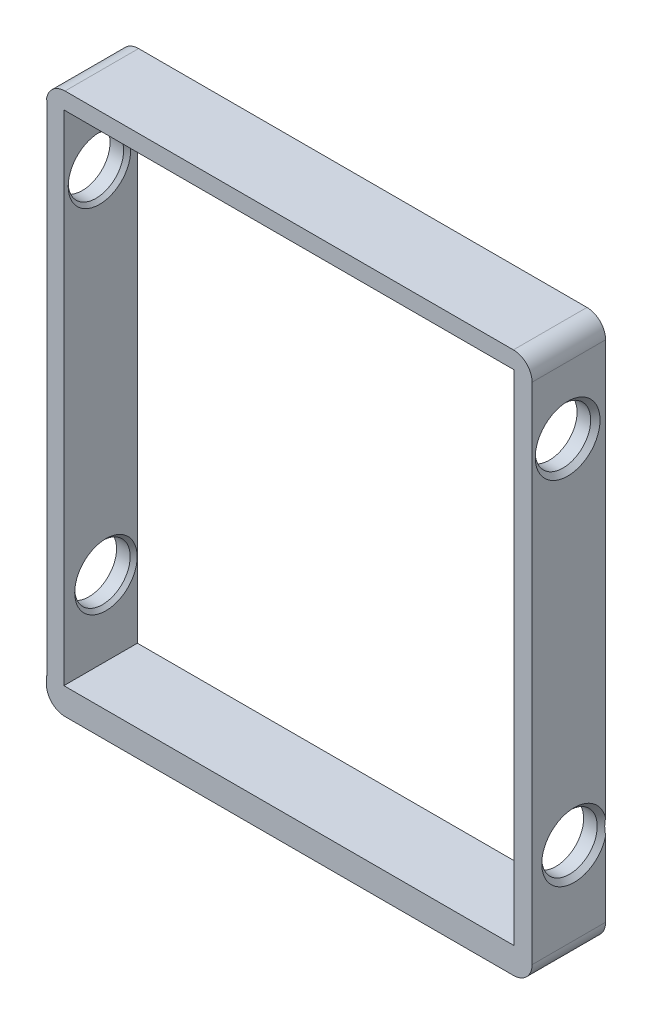
ISO-10303-21;
HEADER;
FILE_DESCRIPTION(('STEP AP214'),'2;1');
FILE_NAME('part.step','',(''),(''),'','','');
FILE_SCHEMA(('AUTOMOTIVE_DESIGN { 1 0 10303 214 1 1 1 1 }'));
ENDSEC;
DATA;
#1=APPLICATION_CONTEXT('core data for automotive mechanical design processes');
#2=APPLICATION_PROTOCOL_DEFINITION('international standard','automotive_design',2000,#1);
#3=PRODUCT_CONTEXT('',#1,'mechanical');
#4=PRODUCT('Part','Part','',(#3));
#5=PRODUCT_RELATED_PRODUCT_CATEGORY('part','',(#4));
#6=PRODUCT_DEFINITION_FORMATION('','',#4);
#7=PRODUCT_DEFINITION_CONTEXT('part definition',#1,'design');
#8=PRODUCT_DEFINITION('design','',#6,#7);
#9=PRODUCT_DEFINITION_SHAPE('','',#8);
#10=(LENGTH_UNIT() NAMED_UNIT(*) SI_UNIT(.MILLI.,.METRE.));
#11=(NAMED_UNIT(*) PLANE_ANGLE_UNIT() SI_UNIT($,.RADIAN.));
#12=(NAMED_UNIT(*) SI_UNIT($,.STERADIAN.) SOLID_ANGLE_UNIT());
#13=UNCERTAINTY_MEASURE_WITH_UNIT(LENGTH_MEASURE(1.E-05),#10,'distance_accuracy_value','');
#14=(GEOMETRIC_REPRESENTATION_CONTEXT(3) GLOBAL_UNCERTAINTY_ASSIGNED_CONTEXT((#13)) GLOBAL_UNIT_ASSIGNED_CONTEXT((#10,
#11,#12)) REPRESENTATION_CONTEXT('',''));
#15=CARTESIAN_POINT('',(0.,0.,0.));
#16=DIRECTION('',(0.,0.,1.));
#17=DIRECTION('',(1.,0.,0.));
#18=AXIS2_PLACEMENT_3D('',#15,#16,#17);
#19=CARTESIAN_POINT('',(26.5094815523711,57.7174566329013,0.));
#20=DIRECTION('',(1.,0.,0.));
#21=DIRECTION('',(0.,1.,0.));
#22=AXIS2_PLACEMENT_3D('',#19,#20,#21);
#23=PLANE('',#22);
#24=CARTESIAN_POINT('',(26.5094815523711,46.1082090890609,5.16610425964473));
#25=DIRECTION('',(1.,0.,0.));
#26=DIRECTION('',(0.,0.,-1.));
#27=AXIS2_PLACEMENT_3D('',#24,#25,#26);
#28=CIRCLE('',#27,4.40563);
#29=CARTESIAN_POINT('',(26.5094815523711,46.1082090890609,0.760474259644726));
#30=VERTEX_POINT('',#29);
#31=EDGE_CURVE('E200',#30,#30,#28,.T.);
#32=ORIENTED_EDGE('',*,*,#31,.F.);
#33=EDGE_LOOP('',(#32));
#34=FACE_BOUND('',#33,.T.);
#35=CARTESIAN_POINT('',(26.5094815523711,-2.17276238100504,4.28021487487287));
#36=DIRECTION('',(1.,0.,0.));
#37=DIRECTION('',(0.,0.,-1.));
#38=AXIS2_PLACEMENT_3D('',#35,#36,#37);
#39=CIRCLE('',#38,4.40563);
#40=CARTESIAN_POINT('',(26.5094815523711,-1.1290496227152,0.));
#41=VERTEX_POINT('',#40);
#42=CARTESIAN_POINT('',(26.5094815523711,-3.21647513929489,0.));
#43=VERTEX_POINT('',#42);
#44=EDGE_CURVE('E68',#41,#43,#39,.T.);
#45=ORIENTED_EDGE('',*,*,#44,.F.);
#46=DIRECTION('',(0.,1.,0.));
#47=VECTOR('',#46,1.);
#48=CARTESIAN_POINT('',(26.5094815523711,57.7174566329013,0.));
#49=LINE('',#48,#47);
#50=CARTESIAN_POINT('',(26.5094815523711,55.1774566329013,0.));
#51=VERTEX_POINT('',#50);
#52=EDGE_CURVE('E254',#41,#51,#49,.T.);
#53=ORIENTED_EDGE('',*,*,#52,.T.);
#54=DIRECTION('',(0.,0.,-1.));
#55=VECTOR('',#54,1.);
#56=CARTESIAN_POINT('',(26.5094815523711,55.1774566329013,0.));
#57=LINE('',#56,#55);
#58=CARTESIAN_POINT('',(26.5094815523711,55.1774566329013,10.));
#59=VERTEX_POINT('',#58);
#60=EDGE_CURVE('E261',#51,#59,#57,.F.);
#61=ORIENTED_EDGE('',*,*,#60,.T.);
#62=DIRECTION('',(0.,1.,0.));
#63=VECTOR('',#62,1.);
#64=CARTESIAN_POINT('',(26.5094815523711,0.,10.));
#65=LINE('',#64,#63);
#66=CARTESIAN_POINT('',(26.5094815523711,-13.4025433670987,10.));
#67=VERTEX_POINT('',#66);
#68=EDGE_CURVE('E266',#67,#59,#65,.T.);
#69=ORIENTED_EDGE('',*,*,#68,.F.);
#70=DIRECTION('',(0.,0.,-1.));
#71=VECTOR('',#70,1.);
#72=CARTESIAN_POINT('',(26.5094815523711,-13.4025433670987,0.));
#73=LINE('',#72,#71);
#74=CARTESIAN_POINT('',(26.5094815523711,-13.4025433670987,0.));
#75=VERTEX_POINT('',#74);
#76=EDGE_CURVE('E272',#67,#75,#73,.T.);
#77=ORIENTED_EDGE('',*,*,#76,.T.);
#78=EDGE_CURVE('E255',#75,#43,#49,.T.);
#79=ORIENTED_EDGE('',*,*,#78,.T.);
#80=EDGE_LOOP('',(#45,#53,#61,#69,#77,#79));
#81=FACE_BOUND('',#80,.T.);
#82=ADVANCED_FACE('F45',(#34,#81),#23,.T.);
#83=CARTESIAN_POINT('',(-39.5305184476289,-15.9425433670987,0.));
#84=DIRECTION('',(0.,-1.,0.));
#85=DIRECTION('',(1.,0.,0.));
#86=AXIS2_PLACEMENT_3D('',#83,#84,#85);
#87=PLANE('',#86);
#88=DIRECTION('',(1.,0.,0.));
#89=VECTOR('',#88,1.);
#90=CARTESIAN_POINT('',(-39.5305184476289,-15.9425433670987,0.));
#91=LINE('',#90,#89);
#92=CARTESIAN_POINT('',(-36.9905184476289,-15.9425433670987,0.));
#93=VERTEX_POINT('',#92);
#94=CARTESIAN_POINT('',(23.9694815523711,-15.9425433670987,0.));
#95=VERTEX_POINT('',#94);
#96=EDGE_CURVE('E258',#93,#95,#91,.T.);
#97=ORIENTED_EDGE('',*,*,#96,.T.);
#98=DIRECTION('',(0.,0.,-1.));
#99=VECTOR('',#98,1.);
#100=CARTESIAN_POINT('',(23.9694815523711,-15.9425433670987,0.));
#101=LINE('',#100,#99);
#102=CARTESIAN_POINT('',(23.9694815523711,-15.9425433670987,10.));
#103=VERTEX_POINT('',#102);
#104=EDGE_CURVE('E288',#95,#103,#101,.F.);
#105=ORIENTED_EDGE('',*,*,#104,.T.);
#106=DIRECTION('',(1.,0.,0.));
#107=VECTOR('',#106,1.);
#108=CARTESIAN_POINT('',(0.,-15.9425433670987,10.));
#109=LINE('',#108,#107);
#110=CARTESIAN_POINT('',(-36.9905184476289,-15.9425433670987,10.));
#111=VERTEX_POINT('',#110);
#112=EDGE_CURVE('E251',#111,#103,#109,.T.);
#113=ORIENTED_EDGE('',*,*,#112,.F.);
#114=DIRECTION('',(0.,0.,-1.));
#115=VECTOR('',#114,1.);
#116=CARTESIAN_POINT('',(-36.9905184476289,-15.9425433670987,0.));
#117=LINE('',#116,#115);
#118=EDGE_CURVE('E285',#111,#93,#117,.T.);
#119=ORIENTED_EDGE('',*,*,#118,.T.);
#120=EDGE_LOOP('',(#97,#105,#113,#119));
#121=FACE_BOUND('',#120,.T.);
#122=ADVANCED_FACE('F332',(#121),#87,.T.);
#123=CARTESIAN_POINT('',(-39.5305184476289,57.7174566329013,0.));
#124=DIRECTION('',(-1.,0.,0.));
#125=DIRECTION('',(0.,-1.,0.));
#126=AXIS2_PLACEMENT_3D('',#123,#124,#125);
#127=PLANE('',#126);
#128=DIRECTION('',(0.,0.,1.));
#129=VECTOR('',#128,1.);
#130=CARTESIAN_POINT('',(-39.5305184476289,-12.3802127885408,0.));
#131=LINE('',#130,#129);
#132=CARTESIAN_POINT('',(-39.5305184476289,-12.3802127885408,0.));
#133=VERTEX_POINT('',#132);
#134=CARTESIAN_POINT('',(-39.5305184476289,-12.3802127885408,10.));
#135=VERTEX_POINT('',#134);
#136=EDGE_CURVE('E175',#133,#135,#131,.T.);
#137=ORIENTED_EDGE('',*,*,#136,.F.);
#138=DIRECTION('',(0.,-1.,0.));
#139=VECTOR('',#138,1.);
#140=CARTESIAN_POINT('',(-39.5305184476289,57.7174566329013,0.));
#141=LINE('',#140,#139);
#142=CARTESIAN_POINT('',(-39.5305184476289,-13.4025433670987,0.));
#143=VERTEX_POINT('',#142);
#144=EDGE_CURVE('E248',#133,#143,#141,.T.);
#145=ORIENTED_EDGE('',*,*,#144,.T.);
#146=DIRECTION('',(0.,0.,-1.));
#147=VECTOR('',#146,1.);
#148=CARTESIAN_POINT('',(-39.5305184476289,-13.4025433670987,0.));
#149=LINE('',#148,#147);
#150=CARTESIAN_POINT('',(-39.5305184476289,-13.4025433670987,10.));
#151=VERTEX_POINT('',#150);
#152=EDGE_CURVE('E298',#143,#151,#149,.F.);
#153=ORIENTED_EDGE('',*,*,#152,.T.);
#154=DIRECTION('',(0.,1.,0.));
#155=VECTOR('',#154,1.);
#156=CARTESIAN_POINT('',(-39.5305184476289,0.,10.));
#157=LINE('',#156,#155);
#158=EDGE_CURVE('E247',#135,#151,#157,.F.);
#159=ORIENTED_EDGE('',*,*,#158,.F.);
#160=EDGE_LOOP('',(#137,#145,#153,#159));
#161=FACE_BOUND('',#160,.T.);
#162=ADVANCED_FACE('F329',(#161),#127,.T.);
#163=CARTESIAN_POINT('',(-39.5305184476289,57.7174566329013,0.));
#164=DIRECTION('',(0.,1.,0.));
#165=DIRECTION('',(-1.,0.,0.));
#166=AXIS2_PLACEMENT_3D('',#163,#164,#165);
#167=PLANE('',#166);
#168=DIRECTION('',(-1.,0.,0.));
#169=VECTOR('',#168,1.);
#170=CARTESIAN_POINT('',(-39.5305184476289,57.7174566329013,0.));
#171=LINE('',#170,#169);
#172=CARTESIAN_POINT('',(23.9694815523712,57.7174566329013,0.));
#173=VERTEX_POINT('',#172);
#174=CARTESIAN_POINT('',(-36.9905184476289,57.7174566329013,0.));
#175=VERTEX_POINT('',#174);
#176=EDGE_CURVE('E250',#173,#175,#171,.T.);
#177=ORIENTED_EDGE('',*,*,#176,.T.);
#178=DIRECTION('',(0.,0.,-1.));
#179=VECTOR('',#178,1.);
#180=CARTESIAN_POINT('',(-36.9905184476289,57.7174566329013,0.));
#181=LINE('',#180,#179);
#182=CARTESIAN_POINT('',(-36.9905184476289,57.7174566329013,10.));
#183=VERTEX_POINT('',#182);
#184=EDGE_CURVE('E304',#175,#183,#181,.F.);
#185=ORIENTED_EDGE('',*,*,#184,.T.);
#186=DIRECTION('',(1.,0.,0.));
#187=VECTOR('',#186,1.);
#188=CARTESIAN_POINT('',(0.,57.7174566329013,10.));
#189=LINE('',#188,#187);
#190=CARTESIAN_POINT('',(23.9694815523712,57.7174566329013,10.));
#191=VERTEX_POINT('',#190);
#192=EDGE_CURVE('E263',#191,#183,#189,.F.);
#193=ORIENTED_EDGE('',*,*,#192,.F.);
#194=DIRECTION('',(0.,0.,-1.));
#195=VECTOR('',#194,1.);
#196=CARTESIAN_POINT('',(23.9694815523712,57.7174566329013,0.));
#197=LINE('',#196,#195);
#198=EDGE_CURVE('E301',#191,#173,#197,.T.);
#199=ORIENTED_EDGE('',*,*,#198,.T.);
#200=EDGE_LOOP('',(#177,#185,#193,#199));
#201=FACE_BOUND('',#200,.T.);
#202=ADVANCED_FACE('F323',(#201),#167,.T.);
#203=CARTESIAN_POINT('',(0.,0.,0.));
#204=DIRECTION('',(0.,0.,1.));
#205=DIRECTION('',(1.,0.,0.));
#206=AXIS2_PLACEMENT_3D('',#203,#204,#205);
#207=PLANE('',#206);
#208=DIRECTION('',(1.,0.,0.));
#209=VECTOR('',#208,1.);
#210=CARTESIAN_POINT('',(0.,-12.3802127885408,0.));
#211=LINE('',#210,#209);
#212=CARTESIAN_POINT('',(-37.1504098736964,-12.3802127885408,0.));
#213=VERTEX_POINT('',#212);
#214=CARTESIAN_POINT('',(24.0242618586237,-12.3802127885408,0.));
#215=VERTEX_POINT('',#214);
#216=EDGE_CURVE('E228',#213,#215,#211,.T.);
#217=ORIENTED_EDGE('',*,*,#216,.T.);
#218=DIRECTION('',(0.,1.,0.));
#219=VECTOR('',#218,1.);
#220=CARTESIAN_POINT('',(24.0242618586237,0.,0.));
#221=LINE('',#220,#219);
#222=CARTESIAN_POINT('',(24.0242618586237,55.4164594921233,0.));
#223=VERTEX_POINT('',#222);
#224=EDGE_CURVE('E244',#215,#223,#221,.T.);
#225=ORIENTED_EDGE('',*,*,#224,.T.);
#226=DIRECTION('',(-1.,0.,0.));
#227=VECTOR('',#226,1.);
#228=CARTESIAN_POINT('',(0.,55.4164594921233,0.));
#229=LINE('',#228,#227);
#230=CARTESIAN_POINT('',(-37.1504098736964,55.4164594921233,0.));
#231=VERTEX_POINT('',#230);
#232=EDGE_CURVE('E241',#223,#231,#229,.T.);
#233=ORIENTED_EDGE('',*,*,#232,.T.);
#234=DIRECTION('',(0.,-1.,0.));
#235=VECTOR('',#234,1.);
#236=CARTESIAN_POINT('',(-37.1504098736964,0.,0.));
#237=LINE('',#236,#235);
#238=EDGE_CURVE('E238',#231,#213,#237,.T.);
#239=ORIENTED_EDGE('',*,*,#238,.T.);
#240=EDGE_LOOP('',(#217,#225,#233,#239));
#241=FACE_BOUND('',#240,.T.);
#242=DIRECTION('',(0.,1.,0.));
#243=VECTOR('',#242,1.);
#244=CARTESIAN_POINT('',(-39.4757381413763,0.,0.));
#245=LINE('',#244,#243);
#246=CARTESIAN_POINT('',(-39.4757381413763,-12.3802127885408,0.));
#247=VERTEX_POINT('',#246);
#248=CARTESIAN_POINT('',(-39.4757381413763,55.4164594921233,0.));
#249=VERTEX_POINT('',#248);
#250=EDGE_CURVE('E166',#247,#249,#245,.T.);
#251=ORIENTED_EDGE('',*,*,#250,.T.);
#252=DIRECTION('',(-1.,0.,0.));
#253=VECTOR('',#252,1.);
#254=CARTESIAN_POINT('',(0.,55.4164594921233,0.));
#255=LINE('',#254,#253);
#256=CARTESIAN_POINT('',(-39.5192488866602,55.4164594921233,0.));
#257=VERTEX_POINT('',#256);
#258=EDGE_CURVE('E192',#249,#257,#255,.T.);
#259=ORIENTED_EDGE('',*,*,#258,.T.);
#260=CARTESIAN_POINT('',(-36.9905184476289,55.1774566329013,0.));
#261=DIRECTION('',(0.,0.,1.));
#262=DIRECTION('',(1.,0.,0.));
#263=AXIS2_PLACEMENT_3D('',#260,#261,#262);
#264=CIRCLE('',#263,2.53999999999999);
#265=EDGE_CURVE('E278',#257,#175,#264,.F.);
#266=ORIENTED_EDGE('',*,*,#265,.T.);
#267=ORIENTED_EDGE('',*,*,#176,.F.);
#268=CARTESIAN_POINT('',(23.9694815523712,55.1774566329013,0.));
#269=DIRECTION('',(0.,0.,1.));
#270=DIRECTION('',(1.,0.,0.));
#271=AXIS2_PLACEMENT_3D('',#268,#269,#270);
#272=CIRCLE('',#271,2.53999999999999);
#273=EDGE_CURVE('E275',#173,#51,#272,.F.);
#274=ORIENTED_EDGE('',*,*,#273,.T.);
#275=ORIENTED_EDGE('',*,*,#52,.F.);
#276=CARTESIAN_POINT('',(27.3144886342901,-5.14437800628135,0.));
#277=CARTESIAN_POINT('',(27.2712276251026,-5.06851306918809,0.));
#278=CARTESIAN_POINT('',(27.2288033845421,-4.99217190890156,0.));
#279=CARTESIAN_POINT('',(27.1458609826951,-4.8384366098738,0.));
#280=CARTESIAN_POINT('',(27.1053433201205,-4.7610422023804,0.));
#281=CARTESIAN_POINT('',(26.9867349355243,-4.52659981179214,0.));
#282=CARTESIAN_POINT('',(26.9119189546052,-4.36786380361834,0.));
#283=CARTESIAN_POINT('',(26.7725597110636,-4.04316484814592,0.));
#284=CARTESIAN_POINT('',(26.7081808794207,-3.87713053800014,0.));
#285=CARTESIAN_POINT('',(26.5943992910559,-3.54017410672882,0.));
#286=CARTESIAN_POINT('',(26.5449720522571,-3.36926048294398,0.));
#287=CARTESIAN_POINT('',(26.4799584901082,-3.08972342562123,0.));
#288=CARTESIAN_POINT('',(26.4586676716259,-2.98241735196453,0.));
#289=CARTESIAN_POINT('',(26.4237447664393,-2.76654052793717,0.));
#290=CARTESIAN_POINT('',(26.4101130541241,-2.65796971600888,0.));
#291=CARTESIAN_POINT('',(26.3911111458481,-2.44097930024858,0.));
#292=CARTESIAN_POINT('',(26.3856755043132,-2.33256547990702,0.));
#293=CARTESIAN_POINT('',(26.383073113827,-2.11563733361422,0.));
#294=CARTESIAN_POINT('',(26.3859065608992,-2.00712300534134,0.));
#295=CARTESIAN_POINT('',(26.4007661845265,-1.77446971110606,0.));
#296=CARTESIAN_POINT('',(26.4140999532049,-1.65041336479439,0.));
#297=CARTESIAN_POINT('',(26.450879696461,-1.40380210618889,0.));
#298=CARTESIAN_POINT('',(26.4743283449274,-1.28124759972556,0.));
#299=CARTESIAN_POINT('',(26.5306324688548,-1.03676933743719,0.));
#300=CARTESIAN_POINT('',(26.5635990797697,-0.914871461359717,0.));
#301=CARTESIAN_POINT('',(26.6375637402529,-0.673596870395876,0.));
#302=CARTESIAN_POINT('',(26.6785600694115,-0.554219621510677,0.));
#303=CARTESIAN_POINT('',(26.7823038664066,-0.278273129342077,0.));
#304=CARTESIAN_POINT('',(26.8477274203599,-0.122714001289644,0.));
#305=CARTESIAN_POINT('',(26.9881359313089,0.184060267302188,0.));
#306=CARTESIAN_POINT('',(27.0631259954584,0.335273034279609,0.));
#307=CARTESIAN_POINT('',(27.2208374342123,0.634281208222182,0.));
#308=CARTESIAN_POINT('',(27.3035858408563,0.782062245592443,0.));
#309=CARTESIAN_POINT('',(27.4749373532114,1.07412887297117,0.));
#310=CARTESIAN_POINT('',(27.5635393629038,1.21841511046475,0.));
#311=CARTESIAN_POINT('',(27.7409997858099,1.49713947341925,0.));
#312=CARTESIAN_POINT('',(27.8296401644751,1.6317171437581,0.));
#313=CARTESIAN_POINT('',(28.0103234101149,1.8985771716374,0.));
#314=CARTESIAN_POINT('',(28.1023665494765,2.03085934417515,0.));
#315=CARTESIAN_POINT('',(28.2884007090331,2.29230062825798,0.));
#316=CARTESIAN_POINT('',(28.3823676455485,2.42147693706759,0.));
#317=CARTESIAN_POINT('',(28.5725410643814,2.67811837980125,0.));
#318=CARTESIAN_POINT('',(28.6687469366096,2.80558396529478,0.));
#319=CARTESIAN_POINT('',(28.7658590461831,2.93234334488588,0.));
#320=B_SPLINE_CURVE_WITH_KNOTS('',3,(#276,#277,#278,#279,#280,#281,#282,#283,#284,#285,#286,
#287,#288,#289,#290,#291,#292,#293,#294,#295,#296,#297,#298,#299,#300,#301,#302,#303,#304,#305,
#306,#307,#308,#309,#310,#311,#312,#313,#314,#315,#316,#317,#318,#319),.UNSPECIFIED.,.F.,.F.,(4,
2,2,2,2,2,2,2,2,2,2,2,2,2,2,2,2,2,2,2,2,4),(0.,0.261987772616421,0.524043697847519,
1.05013221699135,1.58383830005204,2.11666569033946,2.4446207551543,2.77259184952876,
3.09792996471409,3.42327579229656,3.79712857744841,4.17108025195626,4.54958830697742,
4.92801535318556,5.43385206005262,5.93995995069687,6.44790188080563,6.95574897279951,
7.43912752511334,7.92254485544565,8.40173327999602,8.88079262458114),.UNSPECIFIED.);
#321=EDGE_CURVE('E54',#41,#43,#320,.F.);
#322=ORIENTED_EDGE('',*,*,#321,.T.);
#323=ORIENTED_EDGE('',*,*,#78,.F.);
#324=CARTESIAN_POINT('',(23.9694815523711,-13.4025433670987,0.));
#325=DIRECTION('',(0.,0.,1.));
#326=DIRECTION('',(1.,0.,0.));
#327=AXIS2_PLACEMENT_3D('',#324,#325,#326);
#328=CIRCLE('',#327,2.53999999999999);
#329=EDGE_CURVE('E283',#75,#95,#328,.F.);
#330=ORIENTED_EDGE('',*,*,#329,.T.);
#331=ORIENTED_EDGE('',*,*,#96,.F.);
#332=CARTESIAN_POINT('',(-36.9905184476289,-13.4025433670987,0.));
#333=DIRECTION('',(0.,0.,1.));
#334=DIRECTION('',(1.,0.,0.));
#335=AXIS2_PLACEMENT_3D('',#332,#333,#334);
#336=CIRCLE('',#335,2.53999999999999);
#337=EDGE_CURVE('E280',#93,#143,#336,.F.);
#338=ORIENTED_EDGE('',*,*,#337,.T.);
#339=ORIENTED_EDGE('',*,*,#144,.F.);
#340=DIRECTION('',(1.,0.,0.));
#341=VECTOR('',#340,1.);
#342=CARTESIAN_POINT('',(0.,-12.3802127885408,0.));
#343=LINE('',#342,#341);
#344=EDGE_CURVE('E196',#133,#247,#343,.T.);
#345=ORIENTED_EDGE('',*,*,#344,.T.);
#346=EDGE_LOOP('',(#251,#259,#266,#267,#274,#275,#322,#323,#330,#331,#338,#339,#345));
#347=FACE_BOUND('',#346,.T.);
#348=ADVANCED_FACE('F318',(#241,#347),#207,.F.);
#349=CARTESIAN_POINT('',(0.,0.,10.));
#350=DIRECTION('',(0.,0.,1.));
#351=DIRECTION('',(1.,0.,0.));
#352=AXIS2_PLACEMENT_3D('',#349,#350,#351);
#353=PLANE('',#352);
#354=DIRECTION('',(1.,0.,0.));
#355=VECTOR('',#354,1.);
#356=CARTESIAN_POINT('',(-39.4757381413763,55.4164594921233,10.));
#357=LINE('',#356,#355);
#358=CARTESIAN_POINT('',(-39.5192488866602,55.4164594921233,10.));
#359=VERTEX_POINT('',#358);
#360=CARTESIAN_POINT('',(-39.4757381413763,55.4164594921233,10.));
#361=VERTEX_POINT('',#360);
#362=EDGE_CURVE('E61',#359,#361,#357,.T.);
#363=ORIENTED_EDGE('',*,*,#362,.T.);
#364=DIRECTION('',(0.,-1.,0.));
#365=VECTOR('',#364,1.);
#366=CARTESIAN_POINT('',(-39.4757381413763,-12.3802127885408,10.));
#367=LINE('',#366,#365);
#368=CARTESIAN_POINT('',(-39.4757381413763,-12.3802127885408,10.));
#369=VERTEX_POINT('',#368);
#370=EDGE_CURVE('E164',#361,#369,#367,.T.);
#371=ORIENTED_EDGE('',*,*,#370,.T.);
#372=DIRECTION('',(-1.,0.,0.));
#373=VECTOR('',#372,1.);
#374=CARTESIAN_POINT('',(-39.4757381413763,-12.3802127885408,10.));
#375=LINE('',#374,#373);
#376=EDGE_CURVE('E172',#369,#135,#375,.T.);
#377=ORIENTED_EDGE('',*,*,#376,.T.);
#378=ORIENTED_EDGE('',*,*,#158,.T.);
#379=CARTESIAN_POINT('',(-36.9905184476289,-13.4025433670987,10.));
#380=DIRECTION('',(0.,0.,1.));
#381=DIRECTION('',(1.,0.,0.));
#382=AXIS2_PLACEMENT_3D('',#379,#380,#381);
#383=CIRCLE('',#382,2.53999999999999);
#384=EDGE_CURVE('E294',#151,#111,#383,.T.);
#385=ORIENTED_EDGE('',*,*,#384,.T.);
#386=ORIENTED_EDGE('',*,*,#112,.T.);
#387=CARTESIAN_POINT('',(23.9694815523711,-13.4025433670987,10.));
#388=DIRECTION('',(0.,0.,1.));
#389=DIRECTION('',(1.,0.,0.));
#390=AXIS2_PLACEMENT_3D('',#387,#388,#389);
#391=CIRCLE('',#390,2.53999999999999);
#392=EDGE_CURVE('E296',#103,#67,#391,.T.);
#393=ORIENTED_EDGE('',*,*,#392,.T.);
#394=ORIENTED_EDGE('',*,*,#68,.T.);
#395=CARTESIAN_POINT('',(23.9694815523712,55.1774566329013,10.));
#396=DIRECTION('',(0.,0.,1.));
#397=DIRECTION('',(1.,0.,0.));
#398=AXIS2_PLACEMENT_3D('',#395,#396,#397);
#399=CIRCLE('',#398,2.53999999999999);
#400=EDGE_CURVE('E290',#59,#191,#399,.T.);
#401=ORIENTED_EDGE('',*,*,#400,.T.);
#402=ORIENTED_EDGE('',*,*,#192,.T.);
#403=CARTESIAN_POINT('',(-36.9905184476289,55.1774566329013,10.));
#404=DIRECTION('',(0.,0.,1.));
#405=DIRECTION('',(1.,0.,0.));
#406=AXIS2_PLACEMENT_3D('',#403,#404,#405);
#407=CIRCLE('',#406,2.53999999999999);
#408=EDGE_CURVE('E292',#183,#359,#407,.T.);
#409=ORIENTED_EDGE('',*,*,#408,.T.);
#410=EDGE_LOOP('',(#363,#371,#377,#378,#385,#386,#393,#394,#401,#402,#409));
#411=FACE_BOUND('',#410,.T.);
#412=DIRECTION('',(0.,-1.,0.));
#413=VECTOR('',#412,1.);
#414=CARTESIAN_POINT('',(24.0242618586237,-12.3802127885408,10.));
#415=LINE('',#414,#413);
#416=CARTESIAN_POINT('',(24.0242618586237,55.4164594921233,10.));
#417=VERTEX_POINT('',#416);
#418=CARTESIAN_POINT('',(24.0242618586237,-12.3802127885408,10.));
#419=VERTEX_POINT('',#418);
#420=EDGE_CURVE('E212',#417,#419,#415,.T.);
#421=ORIENTED_EDGE('',*,*,#420,.T.);
#422=DIRECTION('',(-1.,0.,0.));
#423=VECTOR('',#422,1.);
#424=CARTESIAN_POINT('',(24.0242618586237,-12.3802127885408,10.));
#425=LINE('',#424,#423);
#426=CARTESIAN_POINT('',(-37.1504098736964,-12.3802127885408,10.));
#427=VERTEX_POINT('',#426);
#428=EDGE_CURVE('E215',#419,#427,#425,.T.);
#429=ORIENTED_EDGE('',*,*,#428,.T.);
#430=DIRECTION('',(0.,1.,0.));
#431=VECTOR('',#430,1.);
#432=CARTESIAN_POINT('',(-37.1504098736964,-12.3802127885408,10.));
#433=LINE('',#432,#431);
#434=CARTESIAN_POINT('',(-37.1504098736964,55.4164594921233,10.));
#435=VERTEX_POINT('',#434);
#436=EDGE_CURVE('E218',#427,#435,#433,.T.);
#437=ORIENTED_EDGE('',*,*,#436,.T.);
#438=DIRECTION('',(1.,0.,0.));
#439=VECTOR('',#438,1.);
#440=CARTESIAN_POINT('',(24.0242618586237,55.4164594921233,10.));
#441=LINE('',#440,#439);
#442=EDGE_CURVE('E221',#435,#417,#441,.T.);
#443=ORIENTED_EDGE('',*,*,#442,.T.);
#444=EDGE_LOOP('',(#421,#429,#437,#443));
#445=FACE_BOUND('',#444,.T.);
#446=ADVANCED_FACE('F179',(#411,#445),#353,.T.);
#447=CARTESIAN_POINT('',(24.0242618586237,-12.3802127885408,10.));
#448=DIRECTION('',(1.,0.,0.));
#449=DIRECTION('',(0.,0.,-1.));
#450=AXIS2_PLACEMENT_3D('',#447,#448,#449);
#451=PLANE('',#450);
#452=CARTESIAN_POINT('',(24.0242618586237,46.1082090890609,5.16610425964473));
#453=DIRECTION('',(1.,0.,0.));
#454=DIRECTION('',(0.,0.,-1.));
#455=AXIS2_PLACEMENT_3D('',#452,#453,#454);
#456=CIRCLE('',#455,3.77063);
#457=CARTESIAN_POINT('',(24.0242618586237,46.1082090890609,1.39547425964473));
#458=VERTEX_POINT('',#457);
#459=EDGE_CURVE('E206',#458,#458,#456,.T.);
#460=ORIENTED_EDGE('',*,*,#459,.T.);
#461=EDGE_LOOP('',(#460));
#462=FACE_BOUND('',#461,.T.);
#463=CARTESIAN_POINT('',(24.0242618586237,-2.17276238100504,4.28021487487287));
#464=DIRECTION('',(1.,0.,0.));
#465=DIRECTION('',(0.,0.,-1.));
#466=AXIS2_PLACEMENT_3D('',#463,#464,#465);
#467=CIRCLE('',#466,3.77063);
#468=CARTESIAN_POINT('',(24.0242618586237,-2.17276238100504,0.509584874872876));
#469=VERTEX_POINT('',#468);
#470=EDGE_CURVE('E211',#469,#469,#467,.T.);
#471=ORIENTED_EDGE('',*,*,#470,.T.);
#472=EDGE_LOOP('',(#471));
#473=FACE_BOUND('',#472,.T.);
#474=DIRECTION('',(0.,0.,-1.));
#475=VECTOR('',#474,1.);
#476=CARTESIAN_POINT('',(24.0242618586237,-12.3802127885408,10.));
#477=LINE('',#476,#475);
#478=EDGE_CURVE('E224',#419,#215,#477,.T.);
#479=ORIENTED_EDGE('',*,*,#478,.F.);
#480=ORIENTED_EDGE('',*,*,#420,.F.);
#481=DIRECTION('',(0.,0.,-1.));
#482=VECTOR('',#481,1.);
#483=CARTESIAN_POINT('',(24.0242618586237,55.4164594921233,10.));
#484=LINE('',#483,#482);
#485=EDGE_CURVE('E225',#417,#223,#484,.T.);
#486=ORIENTED_EDGE('',*,*,#485,.T.);
#487=ORIENTED_EDGE('',*,*,#224,.F.);
#488=EDGE_LOOP('',(#479,#480,#486,#487));
#489=FACE_BOUND('',#488,.T.);
#490=ADVANCED_FACE('F325',(#462,#473,#489),#451,.F.);
#491=CARTESIAN_POINT('',(24.0242618586237,55.4164594921233,10.));
#492=DIRECTION('',(0.,1.,0.));
#493=DIRECTION('',(0.,0.,1.));
#494=AXIS2_PLACEMENT_3D('',#491,#492,#493);
#495=PLANE('',#494);
#496=ORIENTED_EDGE('',*,*,#485,.F.);
#497=ORIENTED_EDGE('',*,*,#442,.F.);
#498=DIRECTION('',(0.,0.,-1.));
#499=VECTOR('',#498,1.);
#500=CARTESIAN_POINT('',(-37.1504098736964,55.4164594921233,10.));
#501=LINE('',#500,#499);
#502=EDGE_CURVE('E229',#435,#231,#501,.T.);
#503=ORIENTED_EDGE('',*,*,#502,.T.);
#504=ORIENTED_EDGE('',*,*,#232,.F.);
#505=EDGE_LOOP('',(#496,#497,#503,#504));
#506=FACE_BOUND('',#505,.T.);
#507=ADVANCED_FACE('F421',(#506),#495,.F.);
#508=CARTESIAN_POINT('',(-37.1504098736964,-12.3802127885408,10.));
#509=DIRECTION('',(-1.,0.,0.));
#510=DIRECTION('',(0.,0.,1.));
#511=AXIS2_PLACEMENT_3D('',#508,#509,#510);
#512=PLANE('',#511);
#513=CARTESIAN_POINT('',(-37.1504098736964,46.1082090890609,5.16610425964473));
#514=DIRECTION('',(-1.,0.,0.));
#515=DIRECTION('',(0.,0.,1.));
#516=AXIS2_PLACEMENT_3D('',#513,#514,#515);
#517=CIRCLE('',#516,4.24573857393241);
#518=CARTESIAN_POINT('',(-37.1504098736964,46.1082090890609,9.41184283357714));
#519=VERTEX_POINT('',#518);
#520=EDGE_CURVE('E49',#519,#519,#517,.T.);
#521=ORIENTED_EDGE('',*,*,#520,.T.);
#522=EDGE_LOOP('',(#521));
#523=FACE_BOUND('',#522,.T.);
#524=CARTESIAN_POINT('',(-37.1504098736964,-2.17276238100504,4.28021487487287));
#525=DIRECTION('',(-1.,0.,0.));
#526=DIRECTION('',(0.,0.,1.));
#527=AXIS2_PLACEMENT_3D('',#524,#525,#526);
#528=CIRCLE('',#527,4.24573857393241);
#529=CARTESIAN_POINT('',(-37.1504098736964,-2.17276238100504,8.52595344880529));
#530=VERTEX_POINT('',#529);
#531=EDGE_CURVE('E182',#530,#530,#528,.T.);
#532=ORIENTED_EDGE('',*,*,#531,.T.);
#533=EDGE_LOOP('',(#532));
#534=FACE_BOUND('',#533,.T.);
#535=ORIENTED_EDGE('',*,*,#502,.F.);
#536=ORIENTED_EDGE('',*,*,#436,.F.);
#537=DIRECTION('',(0.,0.,-1.));
#538=VECTOR('',#537,1.);
#539=CARTESIAN_POINT('',(-37.1504098736964,-12.3802127885408,10.));
#540=LINE('',#539,#538);
#541=EDGE_CURVE('E232',#427,#213,#540,.T.);
#542=ORIENTED_EDGE('',*,*,#541,.T.);
#543=ORIENTED_EDGE('',*,*,#238,.F.);
#544=EDGE_LOOP('',(#535,#536,#542,#543));
#545=FACE_BOUND('',#544,.T.);
#546=ADVANCED_FACE('F419',(#523,#534,#545),#512,.F.);
#547=CARTESIAN_POINT('',(24.0242618586237,-12.3802127885408,10.));
#548=DIRECTION('',(0.,-1.,0.));
#549=DIRECTION('',(0.,0.,-1.));
#550=AXIS2_PLACEMENT_3D('',#547,#548,#549);
#551=PLANE('',#550);
#552=ORIENTED_EDGE('',*,*,#541,.F.);
#553=ORIENTED_EDGE('',*,*,#428,.F.);
#554=ORIENTED_EDGE('',*,*,#478,.T.);
#555=ORIENTED_EDGE('',*,*,#216,.F.);
#556=EDGE_LOOP('',(#552,#553,#554,#555));
#557=FACE_BOUND('',#556,.T.);
#558=ADVANCED_FACE('F347',(#557),#551,.F.);
#559=CARTESIAN_POINT('',(23.9694815523711,-13.4025433670987,0.));
#560=DIRECTION('',(0.,0.,-1.));
#561=DIRECTION('',(-1.,0.,0.));
#562=AXIS2_PLACEMENT_3D('',#559,#560,#561);
#563=CYLINDRICAL_SURFACE('',#562,2.53999999999999);
#564=ORIENTED_EDGE('',*,*,#392,.F.);
#565=ORIENTED_EDGE('',*,*,#104,.F.);
#566=ORIENTED_EDGE('',*,*,#329,.F.);
#567=ORIENTED_EDGE('',*,*,#76,.F.);
#568=EDGE_LOOP('',(#564,#565,#566,#567));
#569=FACE_BOUND('',#568,.T.);
#570=ADVANCED_FACE('F343',(#569),#563,.T.);
#571=CARTESIAN_POINT('',(-36.9905184476289,-13.4025433670987,0.));
#572=DIRECTION('',(0.,0.,-1.));
#573=DIRECTION('',(-1.,0.,0.));
#574=AXIS2_PLACEMENT_3D('',#571,#572,#573);
#575=CYLINDRICAL_SURFACE('',#574,2.53999999999999);
#576=ORIENTED_EDGE('',*,*,#384,.F.);
#577=ORIENTED_EDGE('',*,*,#152,.F.);
#578=ORIENTED_EDGE('',*,*,#337,.F.);
#579=ORIENTED_EDGE('',*,*,#118,.F.);
#580=EDGE_LOOP('',(#576,#577,#578,#579));
#581=FACE_BOUND('',#580,.T.);
#582=ADVANCED_FACE('F346',(#581),#575,.T.);
#583=CARTESIAN_POINT('',(-36.9905184476289,55.1774566329013,0.));
#584=DIRECTION('',(0.,0.,-1.));
#585=DIRECTION('',(-1.,0.,0.));
#586=AXIS2_PLACEMENT_3D('',#583,#584,#585);
#587=CYLINDRICAL_SURFACE('',#586,2.53999999999999);
#588=DIRECTION('',(0.,0.,-1.));
#589=VECTOR('',#588,1.);
#590=CARTESIAN_POINT('',(-39.5192488866602,55.4164594921233,0.));
#591=LINE('',#590,#589);
#592=EDGE_CURVE('E11',#359,#257,#591,.T.);
#593=ORIENTED_EDGE('',*,*,#592,.F.);
#594=ORIENTED_EDGE('',*,*,#408,.F.);
#595=ORIENTED_EDGE('',*,*,#184,.F.);
#596=ORIENTED_EDGE('',*,*,#265,.F.);
#597=EDGE_LOOP('',(#593,#594,#595,#596));
#598=FACE_BOUND('',#597,.T.);
#599=ADVANCED_FACE('F350',(#598),#587,.T.);
#600=CARTESIAN_POINT('',(23.9694815523712,55.1774566329013,0.));
#601=DIRECTION('',(0.,0.,-1.));
#602=DIRECTION('',(-1.,0.,0.));
#603=AXIS2_PLACEMENT_3D('',#600,#601,#602);
#604=CYLINDRICAL_SURFACE('',#603,2.53999999999999);
#605=ORIENTED_EDGE('',*,*,#400,.F.);
#606=ORIENTED_EDGE('',*,*,#60,.F.);
#607=ORIENTED_EDGE('',*,*,#273,.F.);
#608=ORIENTED_EDGE('',*,*,#198,.F.);
#609=EDGE_LOOP('',(#605,#606,#607,#608));
#610=FACE_BOUND('',#609,.T.);
#611=ADVANCED_FACE('F47',(#610),#604,.T.);
#612=CARTESIAN_POINT('',(26.5094815523711,-2.17276238100504,4.28021487487287));
#613=DIRECTION('',(1.,0.,0.));
#614=DIRECTION('',(0.,0.,-1.));
#615=AXIS2_PLACEMENT_3D('',#612,#613,#614);
#616=CYLINDRICAL_SURFACE('',#615,3.77063);
#617=CARTESIAN_POINT('',(25.8744815523711,-2.17276238100504,4.28021487487287));
#618=DIRECTION('',(1.,0.,0.));
#619=DIRECTION('',(0.,0.,-1.));
#620=AXIS2_PLACEMENT_3D('',#617,#618,#619);
#621=CIRCLE('',#620,3.77063);
#622=CARTESIAN_POINT('',(25.8744815523711,-2.17276238100504,0.509584874872874));
#623=VERTEX_POINT('',#622);
#624=EDGE_CURVE('E208',#623,#623,#621,.T.);
#625=ORIENTED_EDGE('',*,*,#624,.T.);
#626=EDGE_LOOP('',(#625));
#627=FACE_BOUND('',#626,.T.);
#628=ORIENTED_EDGE('',*,*,#470,.F.);
#629=EDGE_LOOP('',(#628));
#630=FACE_BOUND('',#629,.T.);
#631=ADVANCED_FACE('F359',(#627,#630),#616,.F.);
#632=CARTESIAN_POINT('',(26.5094815523711,-2.17276238100504,4.28021487487287));
#633=DIRECTION('',(1.,0.,0.));
#634=DIRECTION('',(0.,0.,-1.));
#635=AXIS2_PLACEMENT_3D('',#632,#633,#634);
#636=CONICAL_SURFACE('',#635,4.40563,0.785398163397449);
#637=ORIENTED_EDGE('',*,*,#624,.F.);
#638=EDGE_LOOP('',(#637));
#639=FACE_BOUND('',#638,.T.);
#640=ORIENTED_EDGE('',*,*,#44,.T.);
#641=ORIENTED_EDGE('',*,*,#321,.F.);
#642=EDGE_LOOP('',(#640,#641));
#643=FACE_BOUND('',#642,.T.);
#644=ADVANCED_FACE('F314',(#639,#643),#636,.F.);
#645=CARTESIAN_POINT('',(26.5094815523711,46.1082090890609,5.16610425964473));
#646=DIRECTION('',(1.,0.,0.));
#647=DIRECTION('',(0.,0.,-1.));
#648=AXIS2_PLACEMENT_3D('',#645,#646,#647);
#649=CYLINDRICAL_SURFACE('',#648,3.77063);
#650=CARTESIAN_POINT('',(25.8744815523711,46.1082090890609,5.16610425964473));
#651=DIRECTION('',(1.,0.,0.));
#652=DIRECTION('',(0.,0.,-1.));
#653=AXIS2_PLACEMENT_3D('',#650,#651,#652);
#654=CIRCLE('',#653,3.77063);
#655=CARTESIAN_POINT('',(25.8744815523711,46.1082090890609,1.39547425964473));
#656=VERTEX_POINT('',#655);
#657=EDGE_CURVE('E203',#656,#656,#654,.T.);
#658=ORIENTED_EDGE('',*,*,#657,.T.);
#659=EDGE_LOOP('',(#658));
#660=FACE_BOUND('',#659,.T.);
#661=ORIENTED_EDGE('',*,*,#459,.F.);
#662=EDGE_LOOP('',(#661));
#663=FACE_BOUND('',#662,.T.);
#664=ADVANCED_FACE('F387',(#660,#663),#649,.F.);
#665=CARTESIAN_POINT('',(26.5094815523711,46.1082090890609,5.16610425964473));
#666=DIRECTION('',(1.,0.,0.));
#667=DIRECTION('',(0.,0.,-1.));
#668=AXIS2_PLACEMENT_3D('',#665,#666,#667);
#669=CONICAL_SURFACE('',#668,4.40563,0.785398163397451);
#670=ORIENTED_EDGE('',*,*,#657,.F.);
#671=EDGE_LOOP('',(#670));
#672=FACE_BOUND('',#671,.T.);
#673=ORIENTED_EDGE('',*,*,#31,.T.);
#674=EDGE_LOOP('',(#673));
#675=FACE_BOUND('',#674,.T.);
#676=ADVANCED_FACE('F379',(#672,#675),#669,.F.);
#677=CARTESIAN_POINT('',(-39.4757381413763,-12.3802127885408,10.));
#678=DIRECTION('',(1.,0.,0.));
#679=DIRECTION('',(0.,0.,-1.));
#680=AXIS2_PLACEMENT_3D('',#677,#678,#679);
#681=PLANE('',#680);
#682=CARTESIAN_POINT('',(-39.4757381413763,46.1082090890609,5.16610425964473));
#683=DIRECTION('',(1.,0.,0.));
#684=DIRECTION('',(0.,0.,-1.));
#685=AXIS2_PLACEMENT_3D('',#682,#683,#684);
#686=CIRCLE('',#685,3.77063);
#687=CARTESIAN_POINT('',(-39.4757381413763,46.1082090890609,1.39547425964473));
#688=VERTEX_POINT('',#687);
#689=EDGE_CURVE('E402',#688,#688,#686,.T.);
#690=ORIENTED_EDGE('',*,*,#689,.T.);
#691=EDGE_LOOP('',(#690));
#692=FACE_BOUND('',#691,.T.);
#693=CARTESIAN_POINT('',(-39.4757381413763,-2.17276238100504,4.28021487487287));
#694=DIRECTION('',(1.,0.,0.));
#695=DIRECTION('',(0.,0.,-1.));
#696=AXIS2_PLACEMENT_3D('',#693,#694,#695);
#697=CIRCLE('',#696,3.77063);
#698=CARTESIAN_POINT('',(-39.4757381413763,-2.17276238100504,0.509584874872876));
#699=VERTEX_POINT('',#698);
#700=EDGE_CURVE('E185',#699,#699,#697,.T.);
#701=ORIENTED_EDGE('',*,*,#700,.T.);
#702=EDGE_LOOP('',(#701));
#703=FACE_BOUND('',#702,.T.);
#704=DIRECTION('',(0.,0.,-1.));
#705=VECTOR('',#704,1.);
#706=CARTESIAN_POINT('',(-39.4757381413763,-12.3802127885408,10.));
#707=LINE('',#706,#705);
#708=EDGE_CURVE('E159',#369,#247,#707,.T.);
#709=ORIENTED_EDGE('',*,*,#708,.F.);
#710=ORIENTED_EDGE('',*,*,#370,.F.);
#711=DIRECTION('',(0.,0.,-1.));
#712=VECTOR('',#711,1.);
#713=CARTESIAN_POINT('',(-39.4757381413763,55.4164594921233,10.));
#714=LINE('',#713,#712);
#715=EDGE_CURVE('E169',#361,#249,#714,.T.);
#716=ORIENTED_EDGE('',*,*,#715,.T.);
#717=ORIENTED_EDGE('',*,*,#250,.F.);
#718=EDGE_LOOP('',(#709,#710,#716,#717));
#719=FACE_BOUND('',#718,.T.);
#720=ADVANCED_FACE('F161',(#692,#703,#719),#681,.F.);
#721=CARTESIAN_POINT('',(-39.4757381413763,55.4164594921233,10.));
#722=DIRECTION('',(0.,1.,0.));
#723=DIRECTION('',(0.,0.,1.));
#724=AXIS2_PLACEMENT_3D('',#721,#722,#723);
#725=PLANE('',#724);
#726=ORIENTED_EDGE('',*,*,#715,.F.);
#727=ORIENTED_EDGE('',*,*,#362,.F.);
#728=ORIENTED_EDGE('',*,*,#592,.T.);
#729=ORIENTED_EDGE('',*,*,#258,.F.);
#730=EDGE_LOOP('',(#726,#727,#728,#729));
#731=FACE_BOUND('',#730,.T.);
#732=ADVANCED_FACE('F371',(#731),#725,.F.);
#733=CARTESIAN_POINT('',(-39.4757381413763,-12.3802127885408,10.));
#734=DIRECTION('',(0.,-1.,0.));
#735=DIRECTION('',(0.,0.,-1.));
#736=AXIS2_PLACEMENT_3D('',#733,#734,#735);
#737=PLANE('',#736);
#738=ORIENTED_EDGE('',*,*,#136,.T.);
#739=ORIENTED_EDGE('',*,*,#376,.F.);
#740=ORIENTED_EDGE('',*,*,#708,.T.);
#741=ORIENTED_EDGE('',*,*,#344,.F.);
#742=EDGE_LOOP('',(#738,#739,#740,#741));
#743=FACE_BOUND('',#742,.T.);
#744=ADVANCED_FACE('F173',(#743),#737,.F.);
#745=CARTESIAN_POINT('',(-36.9905184476289,-2.17276238100504,4.28021487487287));
#746=DIRECTION('',(1.,0.,0.));
#747=DIRECTION('',(0.,0.,-1.));
#748=AXIS2_PLACEMENT_3D('',#745,#746,#747);
#749=CONICAL_SURFACE('',#748,4.40563,0.785398163397446);
#750=CARTESIAN_POINT('',(-37.6255184476289,-2.17276238100504,4.28021487487287));
#751=DIRECTION('',(1.,0.,0.));
#752=DIRECTION('',(0.,0.,-1.));
#753=AXIS2_PLACEMENT_3D('',#750,#751,#752);
#754=CIRCLE('',#753,3.77063);
#755=CARTESIAN_POINT('',(-37.6255184476289,-2.17276238100504,0.509584874872874));
#756=VERTEX_POINT('',#755);
#757=EDGE_CURVE('E188',#756,#756,#754,.T.);
#758=ORIENTED_EDGE('',*,*,#757,.F.);
#759=EDGE_LOOP('',(#758));
#760=FACE_BOUND('',#759,.T.);
#761=ORIENTED_EDGE('',*,*,#531,.F.);
#762=EDGE_LOOP('',(#761));
#763=FACE_BOUND('',#762,.T.);
#764=ADVANCED_FACE('F377',(#760,#763),#749,.F.);
#765=CARTESIAN_POINT('',(-36.9905184476289,-2.17276238100504,4.28021487487287));
#766=DIRECTION('',(1.,0.,0.));
#767=DIRECTION('',(0.,0.,-1.));
#768=AXIS2_PLACEMENT_3D('',#765,#766,#767);
#769=CYLINDRICAL_SURFACE('',#768,3.77063);
#770=ORIENTED_EDGE('',*,*,#757,.T.);
#771=EDGE_LOOP('',(#770));
#772=FACE_BOUND('',#771,.T.);
#773=ORIENTED_EDGE('',*,*,#700,.F.);
#774=EDGE_LOOP('',(#773));
#775=FACE_BOUND('',#774,.T.);
#776=ADVANCED_FACE('F383',(#772,#775),#769,.F.);
#777=CARTESIAN_POINT('',(-36.9905184476289,46.1082090890609,5.16610425964473));
#778=DIRECTION('',(1.,0.,0.));
#779=DIRECTION('',(0.,0.,-1.));
#780=AXIS2_PLACEMENT_3D('',#777,#778,#779);
#781=CONICAL_SURFACE('',#780,4.40563,0.785398163397448);
#782=CARTESIAN_POINT('',(-37.6255184476289,46.1082090890609,5.16610425964473));
#783=DIRECTION('',(1.,0.,0.));
#784=DIRECTION('',(0.,0.,-1.));
#785=AXIS2_PLACEMENT_3D('',#782,#783,#784);
#786=CIRCLE('',#785,3.77063);
#787=CARTESIAN_POINT('',(-37.6255184476289,46.1082090890609,1.39547425964473));
#788=VERTEX_POINT('',#787);
#789=EDGE_CURVE('E404',#788,#788,#786,.T.);
#790=ORIENTED_EDGE('',*,*,#789,.F.);
#791=EDGE_LOOP('',(#790));
#792=FACE_BOUND('',#791,.T.);
#793=ORIENTED_EDGE('',*,*,#520,.F.);
#794=EDGE_LOOP('',(#793));
#795=FACE_BOUND('',#794,.T.);
#796=ADVANCED_FACE('F413',(#792,#795),#781,.F.);
#797=CARTESIAN_POINT('',(-36.9905184476289,46.1082090890609,5.16610425964473));
#798=DIRECTION('',(1.,0.,0.));
#799=DIRECTION('',(0.,0.,-1.));
#800=AXIS2_PLACEMENT_3D('',#797,#798,#799);
#801=CYLINDRICAL_SURFACE('',#800,3.77063);
#802=ORIENTED_EDGE('',*,*,#789,.T.);
#803=EDGE_LOOP('',(#802));
#804=FACE_BOUND('',#803,.T.);
#805=ORIENTED_EDGE('',*,*,#689,.F.);
#806=EDGE_LOOP('',(#805));
#807=FACE_BOUND('',#806,.T.);
#808=ADVANCED_FACE('F410',(#804,#807),#801,.F.);
#809=CLOSED_SHELL('',(#82,#122,#162,#202,#348,#446,#490,#507,#546,#558,#570,#582,#599,#611,#631,
#644,#664,#676,#720,#732,#744,#764,#776,#796,#808));
#810=MANIFOLD_SOLID_BREP('B2',#809);
#811=ADVANCED_BREP_SHAPE_REPRESENTATION('',(#18,#810),#14);
#812=SHAPE_DEFINITION_REPRESENTATION(#9,#811);
ENDSEC;
END-ISO-10303-21;
